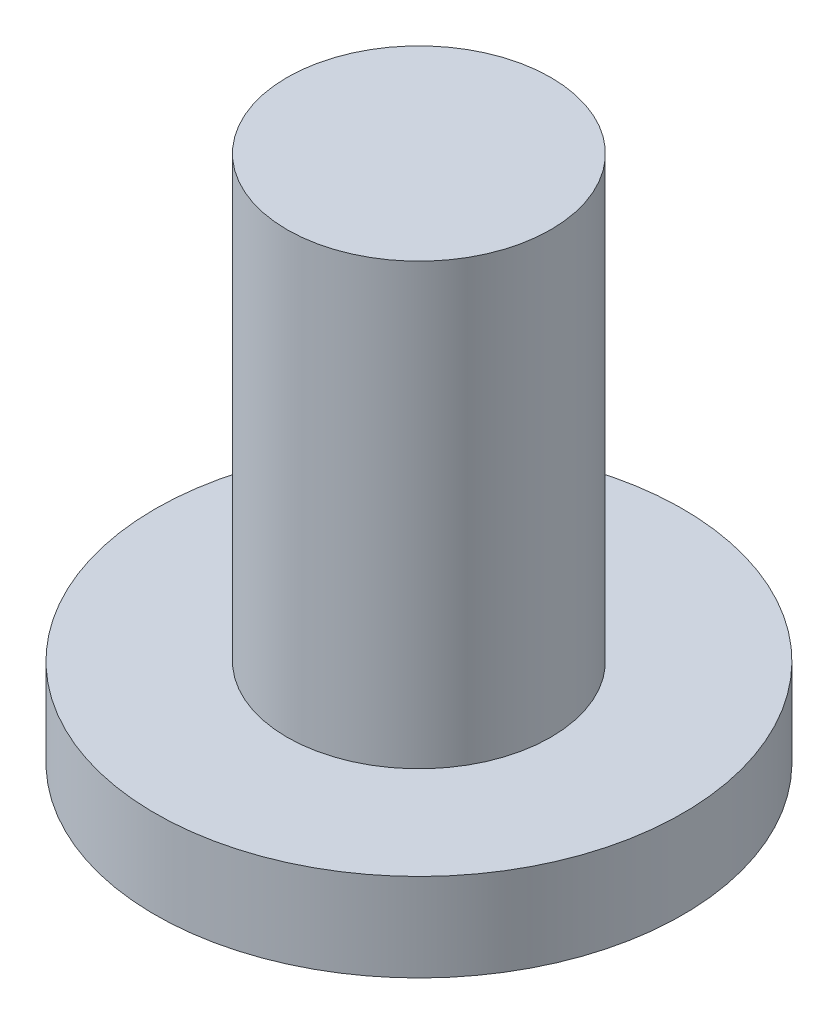
ISO-10303-21;
HEADER;
FILE_DESCRIPTION(('STEP AP214'),'2;1');
FILE_NAME('part.step','',(''),(''),'','','');
FILE_SCHEMA(('AUTOMOTIVE_DESIGN { 1 0 10303 214 1 1 1 1 }'));
ENDSEC;
DATA;
#1=APPLICATION_CONTEXT('core data for automotive mechanical design processes');
#2=APPLICATION_PROTOCOL_DEFINITION('international standard','automotive_design',2000,#1);
#3=PRODUCT_CONTEXT('',#1,'mechanical');
#4=PRODUCT('Part','Part','',(#3));
#5=PRODUCT_RELATED_PRODUCT_CATEGORY('part','',(#4));
#6=PRODUCT_DEFINITION_FORMATION('','',#4);
#7=PRODUCT_DEFINITION_CONTEXT('part definition',#1,'design');
#8=PRODUCT_DEFINITION('design','',#6,#7);
#9=PRODUCT_DEFINITION_SHAPE('','',#8);
#10=(LENGTH_UNIT() NAMED_UNIT(*) SI_UNIT(.MILLI.,.METRE.));
#11=(NAMED_UNIT(*) PLANE_ANGLE_UNIT() SI_UNIT($,.RADIAN.));
#12=(NAMED_UNIT(*) SI_UNIT($,.STERADIAN.) SOLID_ANGLE_UNIT());
#13=UNCERTAINTY_MEASURE_WITH_UNIT(LENGTH_MEASURE(1.E-05),#10,'distance_accuracy_value','');
#14=(GEOMETRIC_REPRESENTATION_CONTEXT(3) GLOBAL_UNCERTAINTY_ASSIGNED_CONTEXT((#13)) GLOBAL_UNIT_ASSIGNED_CONTEXT((#10,
#11,#12)) REPRESENTATION_CONTEXT('',''));
#15=CARTESIAN_POINT('',(0.,0.,0.));
#16=DIRECTION('',(0.,0.,1.));
#17=DIRECTION('',(1.,0.,0.));
#18=AXIS2_PLACEMENT_3D('',#15,#16,#17);
#19=CARTESIAN_POINT('',(0.,0.,0.));
#20=DIRECTION('',(0.,-1.,0.));
#21=DIRECTION('',(1.,0.,0.));
#22=AXIS2_PLACEMENT_3D('',#19,#20,#21);
#23=PLANE('',#22);
#24=CARTESIAN_POINT('',(0.,0.,0.));
#25=DIRECTION('',(0.,1.,0.));
#26=DIRECTION('',(-1.,0.,0.));
#27=AXIS2_PLACEMENT_3D('',#24,#25,#26);
#28=CIRCLE('',#27,6.);
#29=CARTESIAN_POINT('',(-6.,0.,0.));
#30=VERTEX_POINT('',#29);
#31=EDGE_CURVE('E10',#30,#30,#28,.T.);
#32=ORIENTED_EDGE('',*,*,#31,.F.);
#33=EDGE_LOOP('',(#32));
#34=FACE_BOUND('',#33,.T.);
#35=ADVANCED_FACE('F40',(#34),#23,.T.);
#36=CARTESIAN_POINT('',(0.,12.,0.));
#37=DIRECTION('',(0.,1.,0.));
#38=DIRECTION('',(-1.,0.,0.));
#39=AXIS2_PLACEMENT_3D('',#36,#37,#38);
#40=CYLINDRICAL_SURFACE('',#39,6.);
#41=ORIENTED_EDGE('',*,*,#31,.T.);
#42=EDGE_LOOP('',(#41));
#43=FACE_BOUND('',#42,.T.);
#44=CARTESIAN_POINT('',(0.,2.,0.));
#45=DIRECTION('',(0.,1.,0.));
#46=DIRECTION('',(-1.,0.,0.));
#47=AXIS2_PLACEMENT_3D('',#44,#45,#46);
#48=CIRCLE('',#47,6.);
#49=CARTESIAN_POINT('',(-6.,2.,0.));
#50=VERTEX_POINT('',#49);
#51=EDGE_CURVE('E43',#50,#50,#48,.T.);
#52=ORIENTED_EDGE('',*,*,#51,.F.);
#53=EDGE_LOOP('',(#52));
#54=FACE_BOUND('',#53,.T.);
#55=ADVANCED_FACE('F69',(#43,#54),#40,.T.);
#56=CARTESIAN_POINT('',(-6.,2.,0.));
#57=DIRECTION('',(0.,1.,0.));
#58=DIRECTION('',(-1.,0.,0.));
#59=AXIS2_PLACEMENT_3D('',#56,#57,#58);
#60=PLANE('',#59);
#61=ORIENTED_EDGE('',*,*,#51,.T.);
#62=EDGE_LOOP('',(#61));
#63=FACE_BOUND('',#62,.T.);
#64=CARTESIAN_POINT('',(0.,2.,0.));
#65=DIRECTION('',(0.,1.,0.));
#66=DIRECTION('',(-1.,0.,0.));
#67=AXIS2_PLACEMENT_3D('',#64,#65,#66);
#68=CIRCLE('',#67,3.);
#69=CARTESIAN_POINT('',(-3.,2.,0.));
#70=VERTEX_POINT('',#69);
#71=EDGE_CURVE('E50',#70,#70,#68,.T.);
#72=ORIENTED_EDGE('',*,*,#71,.F.);
#73=EDGE_LOOP('',(#72));
#74=FACE_BOUND('',#73,.T.);
#75=ADVANCED_FACE('F61',(#63,#74),#60,.T.);
#76=CARTESIAN_POINT('',(0.,12.,0.));
#77=DIRECTION('',(0.,1.,0.));
#78=DIRECTION('',(-1.,0.,0.));
#79=AXIS2_PLACEMENT_3D('',#76,#77,#78);
#80=CYLINDRICAL_SURFACE('',#79,3.);
#81=ORIENTED_EDGE('',*,*,#71,.T.);
#82=EDGE_LOOP('',(#81));
#83=FACE_BOUND('',#82,.T.);
#84=CARTESIAN_POINT('',(0.,12.,0.));
#85=DIRECTION('',(0.,1.,0.));
#86=DIRECTION('',(-1.,0.,0.));
#87=AXIS2_PLACEMENT_3D('',#84,#85,#86);
#88=CIRCLE('',#87,3.);
#89=CARTESIAN_POINT('',(-3.,12.,0.));
#90=VERTEX_POINT('',#89);
#91=EDGE_CURVE('E51',#90,#90,#88,.T.);
#92=ORIENTED_EDGE('',*,*,#91,.F.);
#93=EDGE_LOOP('',(#92));
#94=FACE_BOUND('',#93,.T.);
#95=ADVANCED_FACE('F56',(#83,#94),#80,.T.);
#96=CARTESIAN_POINT('',(-3.,12.,0.));
#97=DIRECTION('',(0.,1.,0.));
#98=DIRECTION('',(-1.,0.,0.));
#99=AXIS2_PLACEMENT_3D('',#96,#97,#98);
#100=PLANE('',#99);
#101=ORIENTED_EDGE('',*,*,#91,.T.);
#102=EDGE_LOOP('',(#101));
#103=FACE_BOUND('',#102,.T.);
#104=ADVANCED_FACE('F60',(#103),#100,.T.);
#105=CLOSED_SHELL('',(#35,#55,#75,#95,#104));
#106=MANIFOLD_SOLID_BREP('B2',#105);
#107=ADVANCED_BREP_SHAPE_REPRESENTATION('',(#18,#106),#14);
#108=SHAPE_DEFINITION_REPRESENTATION(#9,#107);
ENDSEC;
END-ISO-10303-21;
